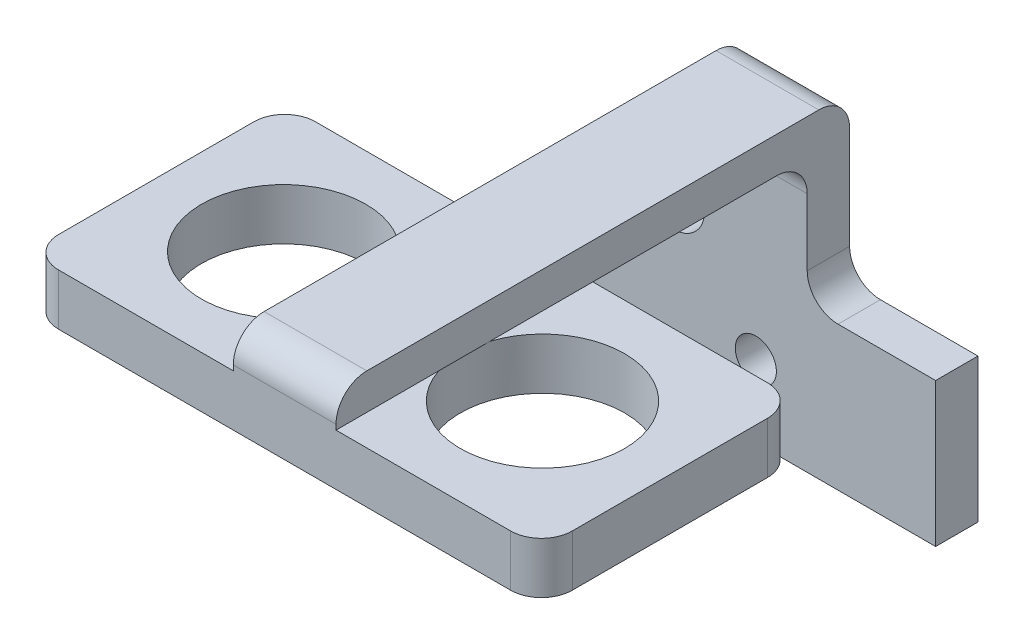
ISO-10303-21;
HEADER;
FILE_DESCRIPTION(('STEP AP214'),'2;1');
FILE_NAME('part.step','',(''),(''),'','','');
FILE_SCHEMA(('AUTOMOTIVE_DESIGN { 1 0 10303 214 1 1 1 1 }'));
ENDSEC;
DATA;
#1=APPLICATION_CONTEXT('core data for automotive mechanical design processes');
#2=APPLICATION_PROTOCOL_DEFINITION('international standard','automotive_design',2000,#1);
#3=PRODUCT_CONTEXT('',#1,'mechanical');
#4=PRODUCT('Part','Part','',(#3));
#5=PRODUCT_RELATED_PRODUCT_CATEGORY('part','',(#4));
#6=PRODUCT_DEFINITION_FORMATION('','',#4);
#7=PRODUCT_DEFINITION_CONTEXT('part definition',#1,'design');
#8=PRODUCT_DEFINITION('design','',#6,#7);
#9=PRODUCT_DEFINITION_SHAPE('','',#8);
#10=(LENGTH_UNIT() NAMED_UNIT(*) SI_UNIT(.MILLI.,.METRE.));
#11=(NAMED_UNIT(*) PLANE_ANGLE_UNIT() SI_UNIT($,.RADIAN.));
#12=(NAMED_UNIT(*) SI_UNIT($,.STERADIAN.) SOLID_ANGLE_UNIT());
#13=UNCERTAINTY_MEASURE_WITH_UNIT(LENGTH_MEASURE(1.E-05),#10,'distance_accuracy_value','');
#14=(GEOMETRIC_REPRESENTATION_CONTEXT(3) GLOBAL_UNCERTAINTY_ASSIGNED_CONTEXT((#13)) GLOBAL_UNIT_ASSIGNED_CONTEXT((#10,
#11,#12)) REPRESENTATION_CONTEXT('',''));
#15=CARTESIAN_POINT('',(0.,0.,0.));
#16=DIRECTION('',(0.,0.,1.));
#17=DIRECTION('',(1.,0.,0.));
#18=AXIS2_PLACEMENT_3D('',#15,#16,#17);
#19=CARTESIAN_POINT('',(-5.,3.5,12.5));
#20=DIRECTION('',(1.,0.,0.));
#21=DIRECTION('',(0.,0.,-1.));
#22=AXIS2_PLACEMENT_3D('',#19,#20,#21);
#23=PLANE('',#22);
#24=DIRECTION('',(0.,-1.,0.));
#25=VECTOR('',#24,1.);
#26=CARTESIAN_POINT('',(-5.,3.5,12.5));
#27=LINE('',#26,#25);
#28=CARTESIAN_POINT('',(-5.,0.5,12.5));
#29=VERTEX_POINT('',#28);
#30=CARTESIAN_POINT('',(-5.,0.,12.5));
#31=VERTEX_POINT('',#30);
#32=EDGE_CURVE('E275',#29,#31,#27,.T.);
#33=ORIENTED_EDGE('',*,*,#32,.F.);
#34=CARTESIAN_POINT('',(-5.,0.5,9.5));
#35=DIRECTION('',(1.,0.,0.));
#36=DIRECTION('',(0.,0.,-1.));
#37=AXIS2_PLACEMENT_3D('',#34,#35,#36);
#38=CIRCLE('',#37,3.);
#39=CARTESIAN_POINT('',(-5.,3.5,9.5));
#40=VERTEX_POINT('',#39);
#41=EDGE_CURVE('E367',#29,#40,#38,.F.);
#42=ORIENTED_EDGE('',*,*,#41,.T.);
#43=DIRECTION('',(0.,0.,1.));
#44=VECTOR('',#43,1.);
#45=CARTESIAN_POINT('',(-5.,3.5,12.5));
#46=LINE('',#45,#44);
#47=CARTESIAN_POINT('',(-5.,3.5,-34.5));
#48=VERTEX_POINT('',#47);
#49=EDGE_CURVE('E272',#48,#40,#46,.T.);
#50=ORIENTED_EDGE('',*,*,#49,.F.);
#51=CARTESIAN_POINT('',(-5.,0.5,-34.5));
#52=DIRECTION('',(1.,0.,0.));
#53=DIRECTION('',(0.,0.,-1.));
#54=AXIS2_PLACEMENT_3D('',#51,#52,#53);
#55=CIRCLE('',#54,3.);
#56=CARTESIAN_POINT('',(-5.,0.5,-37.5));
#57=VERTEX_POINT('',#56);
#58=EDGE_CURVE('E361',#48,#57,#55,.F.);
#59=ORIENTED_EDGE('',*,*,#58,.T.);
#60=DIRECTION('',(0.,-1.,0.));
#61=VECTOR('',#60,1.);
#62=CARTESIAN_POINT('',(-5.,3.5,-37.5));
#63=LINE('',#62,#61);
#64=CARTESIAN_POINT('',(-5.,-9.5,-37.5));
#65=VERTEX_POINT('',#64);
#66=EDGE_CURVE('E282',#57,#65,#63,.T.);
#67=ORIENTED_EDGE('',*,*,#66,.T.);
#68=DIRECTION('',(0.,0.,-1.));
#69=VECTOR('',#68,1.);
#70=CARTESIAN_POINT('',(-5.,-9.5,-33.3733612671495));
#71=LINE('',#70,#69);
#72=CARTESIAN_POINT('',(-5.,-9.5,-33.3733612671495));
#73=VERTEX_POINT('',#72);
#74=EDGE_CURVE('E364',#65,#73,#71,.F.);
#75=ORIENTED_EDGE('',*,*,#74,.T.);
#76=DIRECTION('',(0.,1.,0.));
#77=VECTOR('',#76,1.);
#78=CARTESIAN_POINT('',(-5.,-26.5,-33.3733612671495));
#79=LINE('',#78,#77);
#80=CARTESIAN_POINT('',(-5.,-3.,-33.3733612671495));
#81=VERTEX_POINT('',#80);
#82=EDGE_CURVE('E255',#73,#81,#79,.T.);
#83=ORIENTED_EDGE('',*,*,#82,.T.);
#84=CARTESIAN_POINT('',(-5.,-3.,-30.3733612671495));
#85=DIRECTION('',(1.,0.,0.));
#86=DIRECTION('',(0.,0.,-1.));
#87=AXIS2_PLACEMENT_3D('',#84,#85,#86);
#88=CIRCLE('',#87,3.);
#89=CARTESIAN_POINT('',(-5.,0.,-30.3733612671495));
#90=VERTEX_POINT('',#89);
#91=EDGE_CURVE('E434',#81,#90,#88,.T.);
#92=ORIENTED_EDGE('',*,*,#91,.T.);
#93=DIRECTION('',(0.,0.,1.));
#94=VECTOR('',#93,1.);
#95=CARTESIAN_POINT('',(-5.,0.,12.5));
#96=LINE('',#95,#94);
#97=CARTESIAN_POINT('',(-5.,0.,-12.5));
#98=VERTEX_POINT('',#97);
#99=EDGE_CURVE('E251',#90,#98,#96,.T.);
#100=ORIENTED_EDGE('',*,*,#99,.T.);
#101=CARTESIAN_POINT('',(-5.,0.,-2.4979991993593));
#102=VERTEX_POINT('',#101);
#103=EDGE_CURVE('E336',#98,#102,#96,.T.);
#104=ORIENTED_EDGE('',*,*,#103,.T.);
#105=CARTESIAN_POINT('',(-5.,0.,2.4979991993593));
#106=VERTEX_POINT('',#105);
#107=EDGE_CURVE('E574',#102,#106,#96,.T.);
#108=ORIENTED_EDGE('',*,*,#107,.T.);
#109=EDGE_CURVE('E315',#106,#31,#96,.T.);
#110=ORIENTED_EDGE('',*,*,#109,.T.);
#111=EDGE_LOOP('',(#33,#42,#50,#59,#67,#75,#83,#92,#100,#104,#108,#110));
#112=FACE_BOUND('',#111,.T.);
#113=ADVANCED_FACE('F45',(#112),#23,.F.);
#114=CARTESIAN_POINT('',(5.,3.5,-37.5));
#115=DIRECTION('',(-1.,0.,0.));
#116=DIRECTION('',(0.,0.,1.));
#117=AXIS2_PLACEMENT_3D('',#114,#115,#116);
#118=PLANE('',#117);
#119=DIRECTION('',(0.,1.,0.));
#120=VECTOR('',#119,1.);
#121=CARTESIAN_POINT('',(5.,-26.5,-33.3733612671495));
#122=LINE('',#121,#120);
#123=CARTESIAN_POINT('',(5.,-9.5,-33.3733612671495));
#124=VERTEX_POINT('',#123);
#125=CARTESIAN_POINT('',(5.,-3.,-33.3733612671495));
#126=VERTEX_POINT('',#125);
#127=EDGE_CURVE('E259',#124,#126,#122,.T.);
#128=ORIENTED_EDGE('',*,*,#127,.F.);
#129=DIRECTION('',(0.,0.,1.));
#130=VECTOR('',#129,1.);
#131=CARTESIAN_POINT('',(5.,-9.5,-37.5));
#132=LINE('',#131,#130);
#133=CARTESIAN_POINT('',(5.,-9.5,-37.5));
#134=VERTEX_POINT('',#133);
#135=EDGE_CURVE('E342',#124,#134,#132,.F.);
#136=ORIENTED_EDGE('',*,*,#135,.T.);
#137=DIRECTION('',(0.,-1.,0.));
#138=VECTOR('',#137,1.);
#139=CARTESIAN_POINT('',(5.,3.5,-37.5));
#140=LINE('',#139,#138);
#141=CARTESIAN_POINT('',(5.,0.5,-37.5));
#142=VERTEX_POINT('',#141);
#143=EDGE_CURVE('E290',#142,#134,#140,.T.);
#144=ORIENTED_EDGE('',*,*,#143,.F.);
#145=CARTESIAN_POINT('',(5.,0.5,-34.5));
#146=DIRECTION('',(-1.,0.,0.));
#147=DIRECTION('',(0.,0.,1.));
#148=AXIS2_PLACEMENT_3D('',#145,#146,#147);
#149=CIRCLE('',#148,3.);
#150=CARTESIAN_POINT('',(5.,3.5,-34.5));
#151=VERTEX_POINT('',#150);
#152=EDGE_CURVE('E335',#142,#151,#149,.F.);
#153=ORIENTED_EDGE('',*,*,#152,.T.);
#154=DIRECTION('',(0.,0.,-1.));
#155=VECTOR('',#154,1.);
#156=CARTESIAN_POINT('',(5.,3.5,-37.5));
#157=LINE('',#156,#155);
#158=CARTESIAN_POINT('',(5.,3.5,9.5));
#159=VERTEX_POINT('',#158);
#160=EDGE_CURVE('E269',#159,#151,#157,.T.);
#161=ORIENTED_EDGE('',*,*,#160,.F.);
#162=CARTESIAN_POINT('',(5.,0.5,9.5));
#163=DIRECTION('',(-1.,0.,0.));
#164=DIRECTION('',(0.,0.,1.));
#165=AXIS2_PLACEMENT_3D('',#162,#163,#164);
#166=CIRCLE('',#165,3.);
#167=CARTESIAN_POINT('',(5.,0.5,12.5));
#168=VERTEX_POINT('',#167);
#169=EDGE_CURVE('E339',#159,#168,#166,.F.);
#170=ORIENTED_EDGE('',*,*,#169,.T.);
#171=DIRECTION('',(0.,-1.,0.));
#172=VECTOR('',#171,1.);
#173=CARTESIAN_POINT('',(5.,3.5,12.5));
#174=LINE('',#173,#172);
#175=CARTESIAN_POINT('',(5.,0.,12.5));
#176=VERTEX_POINT('',#175);
#177=EDGE_CURVE('E296',#168,#176,#174,.T.);
#178=ORIENTED_EDGE('',*,*,#177,.T.);
#179=DIRECTION('',(0.,0.,-1.));
#180=VECTOR('',#179,1.);
#181=CARTESIAN_POINT('',(5.,0.,-37.5));
#182=LINE('',#181,#180);
#183=CARTESIAN_POINT('',(5.,0.,2.4979991993593));
#184=VERTEX_POINT('',#183);
#185=EDGE_CURVE('E245',#176,#184,#182,.T.);
#186=ORIENTED_EDGE('',*,*,#185,.T.);
#187=CARTESIAN_POINT('',(5.,0.,-2.4979991993593));
#188=VERTEX_POINT('',#187);
#189=EDGE_CURVE('E230',#184,#188,#182,.T.);
#190=ORIENTED_EDGE('',*,*,#189,.T.);
#191=CARTESIAN_POINT('',(5.,0.,-12.5));
#192=VERTEX_POINT('',#191);
#193=EDGE_CURVE('E234',#188,#192,#182,.T.);
#194=ORIENTED_EDGE('',*,*,#193,.T.);
#195=CARTESIAN_POINT('',(5.,0.,-30.3733612671495));
#196=VERTEX_POINT('',#195);
#197=EDGE_CURVE('E243',#192,#196,#182,.T.);
#198=ORIENTED_EDGE('',*,*,#197,.T.);
#199=CARTESIAN_POINT('',(5.,-3.,-30.3733612671495));
#200=DIRECTION('',(-1.,0.,0.));
#201=DIRECTION('',(0.,0.,1.));
#202=AXIS2_PLACEMENT_3D('',#199,#200,#201);
#203=CIRCLE('',#202,3.);
#204=EDGE_CURVE('E437',#196,#126,#203,.T.);
#205=ORIENTED_EDGE('',*,*,#204,.T.);
#206=EDGE_LOOP('',(#128,#136,#144,#153,#161,#170,#178,#186,#190,#194,#198,#205));
#207=FACE_BOUND('',#206,.T.);
#208=ADVANCED_FACE('F247',(#207),#118,.F.);
#209=CARTESIAN_POINT('',(0.,0.,0.));
#210=DIRECTION('',(0.,-1.,0.));
#211=DIRECTION('',(0.,0.,-1.));
#212=AXIS2_PLACEMENT_3D('',#209,#210,#211);
#213=PLANE('',#212);
#214=ORIENTED_EDGE('',*,*,#99,.F.);
#215=DIRECTION('',(-1.,0.,0.));
#216=VECTOR('',#215,1.);
#217=CARTESIAN_POINT('',(0.,0.,-30.3733612671495));
#218=LINE('',#217,#216);
#219=EDGE_CURVE('E374',#90,#196,#218,.F.);
#220=ORIENTED_EDGE('',*,*,#219,.T.);
#221=ORIENTED_EDGE('',*,*,#197,.F.);
#222=DIRECTION('',(1.,0.,0.));
#223=VECTOR('',#222,1.);
#224=CARTESIAN_POINT('',(-25.,0.,-12.5));
#225=LINE('',#224,#223);
#226=EDGE_CURVE('E312',#98,#192,#225,.T.);
#227=ORIENTED_EDGE('',*,*,#226,.F.);
#228=EDGE_LOOP('',(#214,#220,#221,#227));
#229=FACE_BOUND('',#228,.T.);
#230=ADVANCED_FACE('F587',(#229),#213,.T.);
#231=CARTESIAN_POINT('',(0.,0.,0.));
#232=DIRECTION('',(0.,-1.,0.));
#233=DIRECTION('',(0.,0.,-1.));
#234=AXIS2_PLACEMENT_3D('',#231,#232,#233);
#235=PLANE('',#234);
#236=CARTESIAN_POINT('',(-22.,0.,-12.5));
#237=VERTEX_POINT('',#236);
#238=EDGE_CURVE('E308',#237,#98,#225,.T.);
#239=ORIENTED_EDGE('',*,*,#238,.F.);
#240=CARTESIAN_POINT('',(-22.,0.,-9.5));
#241=DIRECTION('',(0.,-1.,0.));
#242=DIRECTION('',(0.,0.,-1.));
#243=AXIS2_PLACEMENT_3D('',#240,#241,#242);
#244=CIRCLE('',#243,3.);
#245=CARTESIAN_POINT('',(-25.,0.,-9.5));
#246=VERTEX_POINT('',#245);
#247=EDGE_CURVE('E406',#237,#246,#244,.F.);
#248=ORIENTED_EDGE('',*,*,#247,.T.);
#249=DIRECTION('',(0.,0.,-1.));
#250=VECTOR('',#249,1.);
#251=CARTESIAN_POINT('',(-25.,0.,12.5));
#252=LINE('',#251,#250);
#253=CARTESIAN_POINT('',(-25.,0.,9.5));
#254=VERTEX_POINT('',#253);
#255=EDGE_CURVE('E303',#254,#246,#252,.T.);
#256=ORIENTED_EDGE('',*,*,#255,.F.);
#257=CARTESIAN_POINT('',(-22.,0.,9.5));
#258=DIRECTION('',(0.,-1.,0.));
#259=DIRECTION('',(0.,0.,-1.));
#260=AXIS2_PLACEMENT_3D('',#257,#258,#259);
#261=CIRCLE('',#260,3.);
#262=CARTESIAN_POINT('',(-22.,0.,12.5));
#263=VERTEX_POINT('',#262);
#264=EDGE_CURVE('E403',#254,#263,#261,.F.);
#265=ORIENTED_EDGE('',*,*,#264,.T.);
#266=DIRECTION('',(-1.,0.,0.));
#267=VECTOR('',#266,1.);
#268=CARTESIAN_POINT('',(25.,0.,12.5));
#269=LINE('',#268,#267);
#270=EDGE_CURVE('E304',#31,#263,#269,.T.);
#271=ORIENTED_EDGE('',*,*,#270,.F.);
#272=ORIENTED_EDGE('',*,*,#109,.F.);
#273=CARTESIAN_POINT('',(-12.6,0.,0.));
#274=DIRECTION('',(0.,-1.,0.));
#275=DIRECTION('',(0.,0.,-1.));
#276=AXIS2_PLACEMENT_3D('',#273,#274,#275);
#277=CIRCLE('',#276,7.99999999999998);
#278=EDGE_CURVE('E536',#106,#102,#277,.T.);
#279=ORIENTED_EDGE('',*,*,#278,.T.);
#280=ORIENTED_EDGE('',*,*,#103,.F.);
#281=EDGE_LOOP('',(#239,#248,#256,#265,#271,#272,#279,#280));
#282=FACE_BOUND('',#281,.T.);
#283=ADVANCED_FACE('F564',(#282),#235,.F.);
#284=ORIENTED_EDGE('',*,*,#193,.F.);
#285=CARTESIAN_POINT('',(12.6,0.,0.));
#286=DIRECTION('',(0.,-1.,0.));
#287=DIRECTION('',(0.,0.,-1.));
#288=AXIS2_PLACEMENT_3D('',#285,#286,#287);
#289=CIRCLE('',#288,7.99999999999998);
#290=EDGE_CURVE('E218',#188,#184,#289,.T.);
#291=ORIENTED_EDGE('',*,*,#290,.T.);
#292=ORIENTED_EDGE('',*,*,#185,.F.);
#293=CARTESIAN_POINT('',(22.,0.,12.5));
#294=VERTEX_POINT('',#293);
#295=EDGE_CURVE('E300',#294,#176,#269,.T.);
#296=ORIENTED_EDGE('',*,*,#295,.F.);
#297=CARTESIAN_POINT('',(22.,0.,9.5));
#298=DIRECTION('',(0.,-1.,0.));
#299=DIRECTION('',(0.,0.,-1.));
#300=AXIS2_PLACEMENT_3D('',#297,#298,#299);
#301=CIRCLE('',#300,3.);
#302=CARTESIAN_POINT('',(25.,0.,9.5));
#303=VERTEX_POINT('',#302);
#304=EDGE_CURVE('E68',#294,#303,#301,.F.);
#305=ORIENTED_EDGE('',*,*,#304,.T.);
#306=DIRECTION('',(0.,0.,1.));
#307=VECTOR('',#306,1.);
#308=CARTESIAN_POINT('',(25.,0.,-12.5));
#309=LINE('',#308,#307);
#310=CARTESIAN_POINT('',(25.,0.,-9.5));
#311=VERTEX_POINT('',#310);
#312=EDGE_CURVE('E311',#311,#303,#309,.T.);
#313=ORIENTED_EDGE('',*,*,#312,.F.);
#314=CARTESIAN_POINT('',(22.,0.,-9.5));
#315=DIRECTION('',(0.,-1.,0.));
#316=DIRECTION('',(0.,0.,-1.));
#317=AXIS2_PLACEMENT_3D('',#314,#315,#316);
#318=CIRCLE('',#317,3.);
#319=CARTESIAN_POINT('',(22.,0.,-12.5));
#320=VERTEX_POINT('',#319);
#321=EDGE_CURVE('E423',#311,#320,#318,.F.);
#322=ORIENTED_EDGE('',*,*,#321,.T.);
#323=EDGE_CURVE('E237',#192,#320,#225,.T.);
#324=ORIENTED_EDGE('',*,*,#323,.F.);
#325=EDGE_LOOP('',(#284,#291,#292,#296,#305,#313,#322,#324));
#326=FACE_BOUND('',#325,.T.);
#327=ADVANCED_FACE('F235',(#326),#235,.F.);
#328=CARTESIAN_POINT('',(25.,0.,12.5));
#329=DIRECTION('',(0.,0.,1.));
#330=DIRECTION('',(1.,0.,0.));
#331=AXIS2_PLACEMENT_3D('',#328,#329,#330);
#332=PLANE('',#331);
#333=ORIENTED_EDGE('',*,*,#177,.F.);
#334=DIRECTION('',(1.,0.,0.));
#335=VECTOR('',#334,1.);
#336=CARTESIAN_POINT('',(-5.,0.5,12.5));
#337=LINE('',#336,#335);
#338=EDGE_CURVE('E358',#168,#29,#337,.F.);
#339=ORIENTED_EDGE('',*,*,#338,.T.);
#340=ORIENTED_EDGE('',*,*,#32,.T.);
#341=ORIENTED_EDGE('',*,*,#270,.T.);
#342=DIRECTION('',(0.,-1.,0.));
#343=VECTOR('',#342,1.);
#344=CARTESIAN_POINT('',(-22.,0.,12.5));
#345=LINE('',#344,#343);
#346=CARTESIAN_POINT('',(-22.,-5.,12.5));
#347=VERTEX_POINT('',#346);
#348=EDGE_CURVE('E354',#263,#347,#345,.T.);
#349=ORIENTED_EDGE('',*,*,#348,.T.);
#350=DIRECTION('',(-1.,0.,0.));
#351=VECTOR('',#350,1.);
#352=CARTESIAN_POINT('',(25.,-5.,12.5));
#353=LINE('',#352,#351);
#354=CARTESIAN_POINT('',(22.,-5.,12.5));
#355=VERTEX_POINT('',#354);
#356=EDGE_CURVE('E299',#355,#347,#353,.T.);
#357=ORIENTED_EDGE('',*,*,#356,.F.);
#358=DIRECTION('',(0.,-1.,0.));
#359=VECTOR('',#358,1.);
#360=CARTESIAN_POINT('',(22.,0.,12.5));
#361=LINE('',#360,#359);
#362=EDGE_CURVE('E351',#355,#294,#361,.F.);
#363=ORIENTED_EDGE('',*,*,#362,.T.);
#364=ORIENTED_EDGE('',*,*,#295,.T.);
#365=EDGE_LOOP('',(#333,#339,#340,#341,#349,#357,#363,#364));
#366=FACE_BOUND('',#365,.T.);
#367=ADVANCED_FACE('F567',(#366),#332,.T.);
#368=CARTESIAN_POINT('',(25.,0.,-12.5));
#369=DIRECTION('',(1.,0.,0.));
#370=DIRECTION('',(0.,0.,-1.));
#371=AXIS2_PLACEMENT_3D('',#368,#369,#370);
#372=PLANE('',#371);
#373=ORIENTED_EDGE('',*,*,#312,.T.);
#374=DIRECTION('',(0.,-1.,0.));
#375=VECTOR('',#374,1.);
#376=CARTESIAN_POINT('',(25.,0.,9.5));
#377=LINE('',#376,#375);
#378=CARTESIAN_POINT('',(25.,-5.,9.5));
#379=VERTEX_POINT('',#378);
#380=EDGE_CURVE('E419',#303,#379,#377,.T.);
#381=ORIENTED_EDGE('',*,*,#380,.T.);
#382=DIRECTION('',(0.,0.,1.));
#383=VECTOR('',#382,1.);
#384=CARTESIAN_POINT('',(25.,-5.,-12.5));
#385=LINE('',#384,#383);
#386=CARTESIAN_POINT('',(25.,-5.,-9.5));
#387=VERTEX_POINT('',#386);
#388=EDGE_CURVE('E327',#387,#379,#385,.T.);
#389=ORIENTED_EDGE('',*,*,#388,.F.);
#390=DIRECTION('',(0.,-1.,0.));
#391=VECTOR('',#390,1.);
#392=CARTESIAN_POINT('',(25.,0.,-9.5));
#393=LINE('',#392,#391);
#394=EDGE_CURVE('E416',#387,#311,#393,.F.);
#395=ORIENTED_EDGE('',*,*,#394,.T.);
#396=EDGE_LOOP('',(#373,#381,#389,#395));
#397=FACE_BOUND('',#396,.T.);
#398=ADVANCED_FACE('F622',(#397),#372,.T.);
#399=CARTESIAN_POINT('',(-25.,0.,-12.5));
#400=DIRECTION('',(0.,0.,-1.));
#401=DIRECTION('',(-1.,0.,0.));
#402=AXIS2_PLACEMENT_3D('',#399,#400,#401);
#403=PLANE('',#402);
#404=DIRECTION('',(1.,0.,0.));
#405=VECTOR('',#404,1.);
#406=CARTESIAN_POINT('',(-25.,-5.,-12.5));
#407=LINE('',#406,#405);
#408=CARTESIAN_POINT('',(-22.,-5.,-12.5));
#409=VERTEX_POINT('',#408);
#410=CARTESIAN_POINT('',(22.,-5.,-12.5));
#411=VERTEX_POINT('',#410);
#412=EDGE_CURVE('E323',#409,#411,#407,.T.);
#413=ORIENTED_EDGE('',*,*,#412,.F.);
#414=DIRECTION('',(0.,-1.,0.));
#415=VECTOR('',#414,1.);
#416=CARTESIAN_POINT('',(-22.,0.,-12.5));
#417=LINE('',#416,#415);
#418=EDGE_CURVE('E400',#409,#237,#417,.F.);
#419=ORIENTED_EDGE('',*,*,#418,.T.);
#420=ORIENTED_EDGE('',*,*,#238,.T.);
#421=ORIENTED_EDGE('',*,*,#226,.T.);
#422=ORIENTED_EDGE('',*,*,#323,.T.);
#423=DIRECTION('',(0.,-1.,0.));
#424=VECTOR('',#423,1.);
#425=CARTESIAN_POINT('',(22.,0.,-12.5));
#426=LINE('',#425,#424);
#427=EDGE_CURVE('E396',#320,#411,#426,.T.);
#428=ORIENTED_EDGE('',*,*,#427,.T.);
#429=EDGE_LOOP('',(#413,#419,#420,#421,#422,#428));
#430=FACE_BOUND('',#429,.T.);
#431=ADVANCED_FACE('F589',(#430),#403,.T.);
#432=CARTESIAN_POINT('',(-25.,0.,12.5));
#433=DIRECTION('',(-1.,0.,0.));
#434=DIRECTION('',(0.,0.,1.));
#435=AXIS2_PLACEMENT_3D('',#432,#433,#434);
#436=PLANE('',#435);
#437=ORIENTED_EDGE('',*,*,#255,.T.);
#438=DIRECTION('',(0.,-1.,0.));
#439=VECTOR('',#438,1.);
#440=CARTESIAN_POINT('',(-25.,0.,-9.5));
#441=LINE('',#440,#439);
#442=CARTESIAN_POINT('',(-25.,-5.,-9.5));
#443=VERTEX_POINT('',#442);
#444=EDGE_CURVE('E380',#246,#443,#441,.T.);
#445=ORIENTED_EDGE('',*,*,#444,.T.);
#446=DIRECTION('',(0.,0.,-1.));
#447=VECTOR('',#446,1.);
#448=CARTESIAN_POINT('',(-25.,-5.,12.5));
#449=LINE('',#448,#447);
#450=CARTESIAN_POINT('',(-25.,-5.,9.5));
#451=VERTEX_POINT('',#450);
#452=EDGE_CURVE('E319',#451,#443,#449,.T.);
#453=ORIENTED_EDGE('',*,*,#452,.F.);
#454=DIRECTION('',(0.,-1.,0.));
#455=VECTOR('',#454,1.);
#456=CARTESIAN_POINT('',(-25.,0.,9.5));
#457=LINE('',#456,#455);
#458=EDGE_CURVE('E377',#451,#254,#457,.F.);
#459=ORIENTED_EDGE('',*,*,#458,.T.);
#460=EDGE_LOOP('',(#437,#445,#453,#459));
#461=FACE_BOUND('',#460,.T.);
#462=ADVANCED_FACE('F547',(#461),#436,.T.);
#463=CARTESIAN_POINT('',(0.,-5.,0.));
#464=DIRECTION('',(0.,-1.,0.));
#465=DIRECTION('',(0.,0.,-1.));
#466=AXIS2_PLACEMENT_3D('',#463,#464,#465);
#467=PLANE('',#466);
#468=CARTESIAN_POINT('',(12.6,-5.,0.));
#469=DIRECTION('',(0.,-1.,0.));
#470=DIRECTION('',(0.,0.,-1.));
#471=AXIS2_PLACEMENT_3D('',#468,#469,#470);
#472=CIRCLE('',#471,7.99999999999998);
#473=CARTESIAN_POINT('',(12.6,-5.,-7.99999999999998));
#474=VERTEX_POINT('',#473);
#475=EDGE_CURVE('E225',#474,#474,#472,.T.);
#476=ORIENTED_EDGE('',*,*,#475,.F.);
#477=EDGE_LOOP('',(#476));
#478=FACE_BOUND('',#477,.T.);
#479=CARTESIAN_POINT('',(-12.6,-5.,0.));
#480=DIRECTION('',(0.,-1.,0.));
#481=DIRECTION('',(0.,0.,-1.));
#482=AXIS2_PLACEMENT_3D('',#479,#480,#481);
#483=CIRCLE('',#482,7.99999999999998);
#484=CARTESIAN_POINT('',(-12.6,-5.,-7.99999999999998));
#485=VERTEX_POINT('',#484);
#486=EDGE_CURVE('E232',#485,#485,#483,.T.);
#487=ORIENTED_EDGE('',*,*,#486,.F.);
#488=EDGE_LOOP('',(#487));
#489=FACE_BOUND('',#488,.T.);
#490=ORIENTED_EDGE('',*,*,#452,.T.);
#491=CARTESIAN_POINT('',(-22.,-5.,-9.5));
#492=DIRECTION('',(0.,-1.,0.));
#493=DIRECTION('',(0.,0.,-1.));
#494=AXIS2_PLACEMENT_3D('',#491,#492,#493);
#495=CIRCLE('',#494,3.);
#496=EDGE_CURVE('E393',#443,#409,#495,.T.);
#497=ORIENTED_EDGE('',*,*,#496,.T.);
#498=ORIENTED_EDGE('',*,*,#412,.T.);
#499=CARTESIAN_POINT('',(22.,-5.,-9.5));
#500=DIRECTION('',(0.,-1.,0.));
#501=DIRECTION('',(0.,0.,-1.));
#502=AXIS2_PLACEMENT_3D('',#499,#500,#501);
#503=CIRCLE('',#502,3.);
#504=EDGE_CURVE('E384',#411,#387,#503,.T.);
#505=ORIENTED_EDGE('',*,*,#504,.T.);
#506=ORIENTED_EDGE('',*,*,#388,.T.);
#507=CARTESIAN_POINT('',(22.,-5.,9.5));
#508=DIRECTION('',(0.,-1.,0.));
#509=DIRECTION('',(0.,0.,-1.));
#510=AXIS2_PLACEMENT_3D('',#507,#508,#509);
#511=CIRCLE('',#510,3.);
#512=EDGE_CURVE('E387',#379,#355,#511,.T.);
#513=ORIENTED_EDGE('',*,*,#512,.T.);
#514=ORIENTED_EDGE('',*,*,#356,.T.);
#515=CARTESIAN_POINT('',(-22.,-5.,9.5));
#516=DIRECTION('',(0.,-1.,0.));
#517=DIRECTION('',(0.,0.,-1.));
#518=AXIS2_PLACEMENT_3D('',#515,#516,#517);
#519=CIRCLE('',#518,3.);
#520=EDGE_CURVE('E390',#347,#451,#519,.T.);
#521=ORIENTED_EDGE('',*,*,#520,.T.);
#522=EDGE_LOOP('',(#490,#497,#498,#505,#506,#513,#514,#521));
#523=FACE_BOUND('',#522,.T.);
#524=ADVANCED_FACE('F544',(#478,#489,#523),#467,.T.);
#525=CARTESIAN_POINT('',(-5.,3.5,-37.5));
#526=DIRECTION('',(0.,0.,1.));
#527=DIRECTION('',(1.,0.,0.));
#528=AXIS2_PLACEMENT_3D('',#525,#526,#527);
#529=PLANE('',#528);
#530=CARTESIAN_POINT('',(0.,-19.5,-37.5));
#531=DIRECTION('',(0.,0.,-1.));
#532=DIRECTION('',(-1.,0.,0.));
#533=AXIS2_PLACEMENT_3D('',#530,#531,#532);
#534=CIRCLE('',#533,1.99999999999999);
#535=CARTESIAN_POINT('',(-1.99999999999999,-19.5,-37.5));
#536=VERTEX_POINT('',#535);
#537=EDGE_CURVE('E528',#536,#536,#534,.T.);
#538=ORIENTED_EDGE('',*,*,#537,.F.);
#539=EDGE_LOOP('',(#538));
#540=FACE_BOUND('',#539,.T.);
#541=ORIENTED_EDGE('',*,*,#66,.F.);
#542=DIRECTION('',(-1.,0.,0.));
#543=VECTOR('',#542,1.);
#544=CARTESIAN_POINT('',(-5.,0.5,-37.5));
#545=LINE('',#544,#543);
#546=EDGE_CURVE('E413',#57,#142,#545,.F.);
#547=ORIENTED_EDGE('',*,*,#546,.T.);
#548=ORIENTED_EDGE('',*,*,#143,.T.);
#549=CARTESIAN_POINT('',(8.,-9.5,-37.5));
#550=DIRECTION('',(0.,0.,1.));
#551=DIRECTION('',(1.,0.,0.));
#552=AXIS2_PLACEMENT_3D('',#549,#550,#551);
#553=CIRCLE('',#552,3.);
#554=CARTESIAN_POINT('',(8.,-12.5,-37.5));
#555=VERTEX_POINT('',#554);
#556=EDGE_CURVE('E431',#134,#555,#553,.T.);
#557=ORIENTED_EDGE('',*,*,#556,.T.);
#558=DIRECTION('',(-1.,0.,0.));
#559=VECTOR('',#558,1.);
#560=CARTESIAN_POINT('',(17.5,-12.5,-37.5));
#561=LINE('',#560,#559);
#562=CARTESIAN_POINT('',(17.5,-12.5,-37.5));
#563=VERTEX_POINT('',#562);
#564=EDGE_CURVE('E484',#563,#555,#561,.T.);
#565=ORIENTED_EDGE('',*,*,#564,.F.);
#566=DIRECTION('',(0.,1.,0.));
#567=VECTOR('',#566,1.);
#568=CARTESIAN_POINT('',(17.5,-12.5,-37.5));
#569=LINE('',#568,#567);
#570=CARTESIAN_POINT('',(17.5,-26.5,-37.5));
#571=VERTEX_POINT('',#570);
#572=EDGE_CURVE('E481',#571,#563,#569,.T.);
#573=ORIENTED_EDGE('',*,*,#572,.F.);
#574=DIRECTION('',(1.,0.,0.));
#575=VECTOR('',#574,1.);
#576=CARTESIAN_POINT('',(5.,-26.5,-37.5));
#577=LINE('',#576,#575);
#578=CARTESIAN_POINT('',(-17.5,-26.5,-37.5));
#579=VERTEX_POINT('',#578);
#580=EDGE_CURVE('E265',#579,#571,#577,.T.);
#581=ORIENTED_EDGE('',*,*,#580,.F.);
#582=DIRECTION('',(0.,-1.,0.));
#583=VECTOR('',#582,1.);
#584=CARTESIAN_POINT('',(-17.5,-26.5,-37.5));
#585=LINE('',#584,#583);
#586=CARTESIAN_POINT('',(-17.5,-12.5,-37.5));
#587=VERTEX_POINT('',#586);
#588=EDGE_CURVE('E515',#587,#579,#585,.T.);
#589=ORIENTED_EDGE('',*,*,#588,.F.);
#590=DIRECTION('',(1.,0.,0.));
#591=VECTOR('',#590,1.);
#592=CARTESIAN_POINT('',(-17.5,-12.5,-37.5));
#593=LINE('',#592,#591);
#594=CARTESIAN_POINT('',(-8.,-12.5,-37.5));
#595=VERTEX_POINT('',#594);
#596=EDGE_CURVE('E447',#587,#595,#593,.T.);
#597=ORIENTED_EDGE('',*,*,#596,.T.);
#598=CARTESIAN_POINT('',(-8.,-9.5,-37.5));
#599=DIRECTION('',(0.,0.,1.));
#600=DIRECTION('',(1.,0.,0.));
#601=AXIS2_PLACEMENT_3D('',#598,#599,#600);
#602=CIRCLE('',#601,3.);
#603=EDGE_CURVE('E54',#595,#65,#602,.T.);
#604=ORIENTED_EDGE('',*,*,#603,.T.);
#605=EDGE_LOOP('',(#541,#547,#548,#557,#565,#573,#581,#589,#597,#604));
#606=FACE_BOUND('',#605,.T.);
#607=ADVANCED_FACE('F443',(#540,#606),#529,.F.);
#608=CARTESIAN_POINT('',(0.,3.5,0.));
#609=DIRECTION('',(0.,-1.,0.));
#610=DIRECTION('',(0.,0.,-1.));
#611=AXIS2_PLACEMENT_3D('',#608,#609,#610);
#612=PLANE('',#611);
#613=ORIENTED_EDGE('',*,*,#49,.T.);
#614=DIRECTION('',(1.,0.,0.));
#615=VECTOR('',#614,1.);
#616=CARTESIAN_POINT('',(5.,3.5,9.5));
#617=LINE('',#616,#615);
#618=EDGE_CURVE('E348',#40,#159,#617,.T.);
#619=ORIENTED_EDGE('',*,*,#618,.T.);
#620=ORIENTED_EDGE('',*,*,#160,.T.);
#621=DIRECTION('',(-1.,0.,0.));
#622=VECTOR('',#621,1.);
#623=CARTESIAN_POINT('',(0.,3.5,-34.5));
#624=LINE('',#623,#622);
#625=EDGE_CURVE('E345',#151,#48,#624,.T.);
#626=ORIENTED_EDGE('',*,*,#625,.T.);
#627=EDGE_LOOP('',(#613,#619,#620,#626));
#628=FACE_BOUND('',#627,.T.);
#629=ADVANCED_FACE('F617',(#628),#612,.F.);
#630=CARTESIAN_POINT('',(-5.,-26.5,-33.3733612671495));
#631=DIRECTION('',(0.,0.,-1.));
#632=DIRECTION('',(-1.,0.,0.));
#633=AXIS2_PLACEMENT_3D('',#630,#631,#632);
#634=PLANE('',#633);
#635=CARTESIAN_POINT('',(0.,-19.5,-33.3733612671495));
#636=DIRECTION('',(0.,0.,-1.));
#637=DIRECTION('',(-1.,0.,0.));
#638=AXIS2_PLACEMENT_3D('',#635,#636,#637);
#639=CIRCLE('',#638,1.99999999999998);
#640=CARTESIAN_POINT('',(-1.99999999999998,-19.5,-33.3733612671495));
#641=VERTEX_POINT('',#640);
#642=EDGE_CURVE('E521',#641,#641,#639,.T.);
#643=ORIENTED_EDGE('',*,*,#642,.T.);
#644=EDGE_LOOP('',(#643));
#645=FACE_BOUND('',#644,.T.);
#646=ORIENTED_EDGE('',*,*,#127,.T.);
#647=DIRECTION('',(-1.,0.,0.));
#648=VECTOR('',#647,1.);
#649=CARTESIAN_POINT('',(-5.,-3.,-33.3733612671495));
#650=LINE('',#649,#648);
#651=EDGE_CURVE('E370',#126,#81,#650,.T.);
#652=ORIENTED_EDGE('',*,*,#651,.T.);
#653=ORIENTED_EDGE('',*,*,#82,.F.);
#654=CARTESIAN_POINT('',(-8.,-9.5,-33.3733612671495));
#655=DIRECTION('',(0.,0.,-1.));
#656=DIRECTION('',(-1.,0.,0.));
#657=AXIS2_PLACEMENT_3D('',#654,#655,#656);
#658=CIRCLE('',#657,3.);
#659=CARTESIAN_POINT('',(-8.,-12.5,-33.3733612671495));
#660=VERTEX_POINT('',#659);
#661=EDGE_CURVE('E11',#73,#660,#658,.T.);
#662=ORIENTED_EDGE('',*,*,#661,.T.);
#663=DIRECTION('',(1.,0.,0.));
#664=VECTOR('',#663,1.);
#665=CARTESIAN_POINT('',(-17.5,-12.5,-33.3733612671495));
#666=LINE('',#665,#664);
#667=CARTESIAN_POINT('',(-17.5,-12.5,-33.3733612671495));
#668=VERTEX_POINT('',#667);
#669=EDGE_CURVE('E458',#668,#660,#666,.T.);
#670=ORIENTED_EDGE('',*,*,#669,.F.);
#671=DIRECTION('',(0.,1.,0.));
#672=VECTOR('',#671,1.);
#673=CARTESIAN_POINT('',(-17.5,-12.5,-33.3733612671495));
#674=LINE('',#673,#672);
#675=CARTESIAN_POINT('',(-17.5,-26.5,-33.3733612671495));
#676=VERTEX_POINT('',#675);
#677=EDGE_CURVE('E512',#676,#668,#674,.T.);
#678=ORIENTED_EDGE('',*,*,#677,.F.);
#679=DIRECTION('',(-1.,0.,0.));
#680=VECTOR('',#679,1.);
#681=CARTESIAN_POINT('',(-5.,-26.5,-33.3733612671495));
#682=LINE('',#681,#680);
#683=CARTESIAN_POINT('',(17.5,-26.5,-33.3733612671495));
#684=VERTEX_POINT('',#683);
#685=EDGE_CURVE('E492',#684,#676,#682,.T.);
#686=ORIENTED_EDGE('',*,*,#685,.F.);
#687=DIRECTION('',(0.,-1.,0.));
#688=VECTOR('',#687,1.);
#689=CARTESIAN_POINT('',(17.5,-26.5,-33.3733612671495));
#690=LINE('',#689,#688);
#691=CARTESIAN_POINT('',(17.5,-12.5,-33.3733612671495));
#692=VERTEX_POINT('',#691);
#693=EDGE_CURVE('E469',#692,#684,#690,.T.);
#694=ORIENTED_EDGE('',*,*,#693,.F.);
#695=DIRECTION('',(-1.,0.,0.));
#696=VECTOR('',#695,1.);
#697=CARTESIAN_POINT('',(17.5,-12.5,-33.3733612671495));
#698=LINE('',#697,#696);
#699=CARTESIAN_POINT('',(8.,-12.5,-33.3733612671495));
#700=VERTEX_POINT('',#699);
#701=EDGE_CURVE('E488',#692,#700,#698,.T.);
#702=ORIENTED_EDGE('',*,*,#701,.T.);
#703=CARTESIAN_POINT('',(8.,-9.5,-33.3733612671495));
#704=DIRECTION('',(0.,0.,-1.));
#705=DIRECTION('',(-1.,0.,0.));
#706=AXIS2_PLACEMENT_3D('',#703,#704,#705);
#707=CIRCLE('',#706,3.);
#708=EDGE_CURVE('E428',#700,#124,#707,.T.);
#709=ORIENTED_EDGE('',*,*,#708,.T.);
#710=EDGE_LOOP('',(#646,#652,#653,#662,#670,#678,#686,#694,#702,#709));
#711=FACE_BOUND('',#710,.T.);
#712=ADVANCED_FACE('F456',(#645,#711),#634,.F.);
#713=CARTESIAN_POINT('',(0.,-26.5,0.));
#714=DIRECTION('',(0.,1.,0.));
#715=DIRECTION('',(0.,0.,1.));
#716=AXIS2_PLACEMENT_3D('',#713,#714,#715);
#717=PLANE('',#716);
#718=ORIENTED_EDGE('',*,*,#685,.T.);
#719=DIRECTION('',(0.,0.,1.));
#720=VECTOR('',#719,1.);
#721=CARTESIAN_POINT('',(-17.5,-26.5,-33.3733612671495));
#722=LINE('',#721,#720);
#723=EDGE_CURVE('E500',#579,#676,#722,.T.);
#724=ORIENTED_EDGE('',*,*,#723,.F.);
#725=ORIENTED_EDGE('',*,*,#580,.T.);
#726=DIRECTION('',(0.,0.,-1.));
#727=VECTOR('',#726,1.);
#728=CARTESIAN_POINT('',(17.5,-26.5,-37.5));
#729=LINE('',#728,#727);
#730=EDGE_CURVE('E477',#684,#571,#729,.T.);
#731=ORIENTED_EDGE('',*,*,#730,.F.);
#732=EDGE_LOOP('',(#718,#724,#725,#731));
#733=FACE_BOUND('',#732,.T.);
#734=ADVANCED_FACE('F498',(#733),#717,.F.);
#735=CARTESIAN_POINT('',(17.5,-12.5,-33.3733612671495));
#736=DIRECTION('',(0.,-1.,0.));
#737=DIRECTION('',(0.,0.,-1.));
#738=AXIS2_PLACEMENT_3D('',#735,#736,#737);
#739=PLANE('',#738);
#740=ORIENTED_EDGE('',*,*,#564,.T.);
#741=DIRECTION('',(0.,0.,1.));
#742=VECTOR('',#741,1.);
#743=CARTESIAN_POINT('',(8.,-12.5,-33.3733612671495));
#744=LINE('',#743,#742);
#745=EDGE_CURVE('E331',#555,#700,#744,.T.);
#746=ORIENTED_EDGE('',*,*,#745,.T.);
#747=ORIENTED_EDGE('',*,*,#701,.F.);
#748=DIRECTION('',(0.,0.,1.));
#749=VECTOR('',#748,1.);
#750=CARTESIAN_POINT('',(17.5,-12.5,-33.3733612671495));
#751=LINE('',#750,#749);
#752=EDGE_CURVE('E464',#563,#692,#751,.T.);
#753=ORIENTED_EDGE('',*,*,#752,.F.);
#754=EDGE_LOOP('',(#740,#746,#747,#753));
#755=FACE_BOUND('',#754,.T.);
#756=ADVANCED_FACE('F511',(#755),#739,.F.);
#757=CARTESIAN_POINT('',(17.5,0.,0.));
#758=DIRECTION('',(-1.,0.,0.));
#759=DIRECTION('',(0.,0.,1.));
#760=AXIS2_PLACEMENT_3D('',#757,#758,#759);
#761=PLANE('',#760);
#762=ORIENTED_EDGE('',*,*,#752,.T.);
#763=ORIENTED_EDGE('',*,*,#693,.T.);
#764=ORIENTED_EDGE('',*,*,#730,.T.);
#765=ORIENTED_EDGE('',*,*,#572,.T.);
#766=EDGE_LOOP('',(#762,#763,#764,#765));
#767=FACE_BOUND('',#766,.T.);
#768=ADVANCED_FACE('F504',(#767),#761,.F.);
#769=CARTESIAN_POINT('',(-17.5,-12.5,-37.5));
#770=DIRECTION('',(0.,-1.,0.));
#771=DIRECTION('',(0.,0.,-1.));
#772=AXIS2_PLACEMENT_3D('',#769,#770,#771);
#773=PLANE('',#772);
#774=ORIENTED_EDGE('',*,*,#669,.T.);
#775=DIRECTION('',(0.,0.,-1.));
#776=VECTOR('',#775,1.);
#777=CARTESIAN_POINT('',(-8.,-12.5,-37.5));
#778=LINE('',#777,#776);
#779=EDGE_CURVE('E409',#660,#595,#778,.T.);
#780=ORIENTED_EDGE('',*,*,#779,.T.);
#781=ORIENTED_EDGE('',*,*,#596,.F.);
#782=DIRECTION('',(0.,0.,-1.));
#783=VECTOR('',#782,1.);
#784=CARTESIAN_POINT('',(-17.5,-12.5,-37.5));
#785=LINE('',#784,#783);
#786=EDGE_CURVE('E462',#668,#587,#785,.T.);
#787=ORIENTED_EDGE('',*,*,#786,.F.);
#788=EDGE_LOOP('',(#774,#780,#781,#787));
#789=FACE_BOUND('',#788,.T.);
#790=ADVANCED_FACE('F461',(#789),#773,.F.);
#791=CARTESIAN_POINT('',(-17.5,0.,0.));
#792=DIRECTION('',(1.,0.,0.));
#793=DIRECTION('',(0.,0.,-1.));
#794=AXIS2_PLACEMENT_3D('',#791,#792,#793);
#795=PLANE('',#794);
#796=ORIENTED_EDGE('',*,*,#588,.T.);
#797=ORIENTED_EDGE('',*,*,#723,.T.);
#798=ORIENTED_EDGE('',*,*,#677,.T.);
#799=ORIENTED_EDGE('',*,*,#786,.T.);
#800=EDGE_LOOP('',(#796,#797,#798,#799));
#801=FACE_BOUND('',#800,.T.);
#802=ADVANCED_FACE('F514',(#801),#795,.F.);
#803=CARTESIAN_POINT('',(0.,-19.5,-37.5));
#804=DIRECTION('',(0.,0.,-1.));
#805=DIRECTION('',(-1.,0.,0.));
#806=AXIS2_PLACEMENT_3D('',#803,#804,#805);
#807=CYLINDRICAL_SURFACE('',#806,1.99999999999998);
#808=ORIENTED_EDGE('',*,*,#537,.T.);
#809=EDGE_LOOP('',(#808));
#810=FACE_BOUND('',#809,.T.);
#811=ORIENTED_EDGE('',*,*,#642,.F.);
#812=EDGE_LOOP('',(#811));
#813=FACE_BOUND('',#812,.T.);
#814=ADVANCED_FACE('F653',(#810,#813),#807,.F.);
#815=CARTESIAN_POINT('',(-12.6,0.,0.));
#816=DIRECTION('',(0.,1.,0.));
#817=DIRECTION('',(0.,0.,1.));
#818=AXIS2_PLACEMENT_3D('',#815,#816,#817);
#819=PLANE('',#818);
#820=EDGE_CURVE('E532',#102,#106,#277,.T.);
#821=ORIENTED_EDGE('',*,*,#820,.T.);
#822=ORIENTED_EDGE('',*,*,#107,.F.);
#823=EDGE_LOOP('',(#821,#822));
#824=FACE_BOUND('',#823,.T.);
#825=ADVANCED_FACE('F645',(#824),#819,.F.);
#826=CARTESIAN_POINT('',(-12.6,-5.,0.));
#827=DIRECTION('',(0.,-1.,0.));
#828=DIRECTION('',(0.,0.,-1.));
#829=AXIS2_PLACEMENT_3D('',#826,#827,#828);
#830=CYLINDRICAL_SURFACE('',#829,7.99999999999998);
#831=ORIENTED_EDGE('',*,*,#820,.F.);
#832=ORIENTED_EDGE('',*,*,#278,.F.);
#833=EDGE_LOOP('',(#831,#832));
#834=FACE_BOUND('',#833,.T.);
#835=ORIENTED_EDGE('',*,*,#486,.T.);
#836=EDGE_LOOP('',(#835));
#837=FACE_BOUND('',#836,.T.);
#838=ADVANCED_FACE('F635',(#834,#837),#830,.F.);
#839=CARTESIAN_POINT('',(8.,-9.5,-33.3733612671495));
#840=DIRECTION('',(0.,0.,-1.));
#841=DIRECTION('',(-1.,0.,0.));
#842=AXIS2_PLACEMENT_3D('',#839,#840,#841);
#843=CYLINDRICAL_SURFACE('',#842,3.);
#844=ORIENTED_EDGE('',*,*,#556,.F.);
#845=ORIENTED_EDGE('',*,*,#135,.F.);
#846=ORIENTED_EDGE('',*,*,#708,.F.);
#847=ORIENTED_EDGE('',*,*,#745,.F.);
#848=EDGE_LOOP('',(#844,#845,#846,#847));
#849=FACE_BOUND('',#848,.T.);
#850=ADVANCED_FACE('F632',(#849),#843,.F.);
#851=CARTESIAN_POINT('',(0.,0.5,9.5));
#852=DIRECTION('',(-1.,0.,0.));
#853=DIRECTION('',(0.,0.,1.));
#854=AXIS2_PLACEMENT_3D('',#851,#852,#853);
#855=CYLINDRICAL_SURFACE('',#854,3.);
#856=ORIENTED_EDGE('',*,*,#41,.F.);
#857=ORIENTED_EDGE('',*,*,#338,.F.);
#858=ORIENTED_EDGE('',*,*,#169,.F.);
#859=ORIENTED_EDGE('',*,*,#618,.F.);
#860=EDGE_LOOP('',(#856,#857,#858,#859));
#861=FACE_BOUND('',#860,.T.);
#862=ADVANCED_FACE('F602',(#861),#855,.T.);
#863=CARTESIAN_POINT('',(-5.,-3.,-30.3733612671495));
#864=DIRECTION('',(-1.,0.,0.));
#865=DIRECTION('',(0.,0.,1.));
#866=AXIS2_PLACEMENT_3D('',#863,#864,#865);
#867=CYLINDRICAL_SURFACE('',#866,3.);
#868=ORIENTED_EDGE('',*,*,#204,.F.);
#869=ORIENTED_EDGE('',*,*,#219,.F.);
#870=ORIENTED_EDGE('',*,*,#91,.F.);
#871=ORIENTED_EDGE('',*,*,#651,.F.);
#872=EDGE_LOOP('',(#868,#869,#870,#871));
#873=FACE_BOUND('',#872,.T.);
#874=ADVANCED_FACE('F595',(#873),#867,.F.);
#875=CARTESIAN_POINT('',(-22.,0.,-9.5));
#876=DIRECTION('',(0.,-1.,0.));
#877=DIRECTION('',(0.,0.,-1.));
#878=AXIS2_PLACEMENT_3D('',#875,#876,#877);
#879=CYLINDRICAL_SURFACE('',#878,3.);
#880=ORIENTED_EDGE('',*,*,#247,.F.);
#881=ORIENTED_EDGE('',*,*,#418,.F.);
#882=ORIENTED_EDGE('',*,*,#496,.F.);
#883=ORIENTED_EDGE('',*,*,#444,.F.);
#884=EDGE_LOOP('',(#880,#881,#882,#883));
#885=FACE_BOUND('',#884,.T.);
#886=ADVANCED_FACE('F593',(#885),#879,.T.);
#887=CARTESIAN_POINT('',(-8.,-9.5,-37.5));
#888=DIRECTION('',(0.,0.,1.));
#889=DIRECTION('',(1.,0.,0.));
#890=AXIS2_PLACEMENT_3D('',#887,#888,#889);
#891=CYLINDRICAL_SURFACE('',#890,3.);
#892=ORIENTED_EDGE('',*,*,#661,.F.);
#893=ORIENTED_EDGE('',*,*,#74,.F.);
#894=ORIENTED_EDGE('',*,*,#603,.F.);
#895=ORIENTED_EDGE('',*,*,#779,.F.);
#896=EDGE_LOOP('',(#892,#893,#894,#895));
#897=FACE_BOUND('',#896,.T.);
#898=ADVANCED_FACE('F452',(#897),#891,.F.);
#899=CARTESIAN_POINT('',(-22.,0.,9.5));
#900=DIRECTION('',(0.,-1.,0.));
#901=DIRECTION('',(0.,0.,-1.));
#902=AXIS2_PLACEMENT_3D('',#899,#900,#901);
#903=CYLINDRICAL_SURFACE('',#902,3.);
#904=ORIENTED_EDGE('',*,*,#264,.F.);
#905=ORIENTED_EDGE('',*,*,#458,.F.);
#906=ORIENTED_EDGE('',*,*,#520,.F.);
#907=ORIENTED_EDGE('',*,*,#348,.F.);
#908=EDGE_LOOP('',(#904,#905,#906,#907));
#909=FACE_BOUND('',#908,.T.);
#910=ADVANCED_FACE('F559',(#909),#903,.T.);
#911=CARTESIAN_POINT('',(0.,0.5,-34.5));
#912=DIRECTION('',(-1.,0.,0.));
#913=DIRECTION('',(0.,0.,1.));
#914=AXIS2_PLACEMENT_3D('',#911,#912,#913);
#915=CYLINDRICAL_SURFACE('',#914,3.);
#916=ORIENTED_EDGE('',*,*,#152,.F.);
#917=ORIENTED_EDGE('',*,*,#546,.F.);
#918=ORIENTED_EDGE('',*,*,#58,.F.);
#919=ORIENTED_EDGE('',*,*,#625,.F.);
#920=EDGE_LOOP('',(#916,#917,#918,#919));
#921=FACE_BOUND('',#920,.T.);
#922=ADVANCED_FACE('F738',(#921),#915,.T.);
#923=CARTESIAN_POINT('',(22.,0.,9.5));
#924=DIRECTION('',(0.,-1.,0.));
#925=DIRECTION('',(0.,0.,-1.));
#926=AXIS2_PLACEMENT_3D('',#923,#924,#925);
#927=CYLINDRICAL_SURFACE('',#926,3.);
#928=ORIENTED_EDGE('',*,*,#304,.F.);
#929=ORIENTED_EDGE('',*,*,#362,.F.);
#930=ORIENTED_EDGE('',*,*,#512,.F.);
#931=ORIENTED_EDGE('',*,*,#380,.F.);
#932=EDGE_LOOP('',(#928,#929,#930,#931));
#933=FACE_BOUND('',#932,.T.);
#934=ADVANCED_FACE('F747',(#933),#927,.T.);
#935=CARTESIAN_POINT('',(22.,0.,-9.5));
#936=DIRECTION('',(0.,-1.,0.));
#937=DIRECTION('',(0.,0.,-1.));
#938=AXIS2_PLACEMENT_3D('',#935,#936,#937);
#939=CYLINDRICAL_SURFACE('',#938,3.);
#940=ORIENTED_EDGE('',*,*,#321,.F.);
#941=ORIENTED_EDGE('',*,*,#394,.F.);
#942=ORIENTED_EDGE('',*,*,#504,.F.);
#943=ORIENTED_EDGE('',*,*,#427,.F.);
#944=EDGE_LOOP('',(#940,#941,#942,#943));
#945=FACE_BOUND('',#944,.T.);
#946=ADVANCED_FACE('F47',(#945),#939,.T.);
#947=CARTESIAN_POINT('',(12.6,0.,0.));
#948=DIRECTION('',(0.,1.,0.));
#949=DIRECTION('',(0.,0.,1.));
#950=AXIS2_PLACEMENT_3D('',#947,#948,#949);
#951=PLANE('',#950);
#952=EDGE_CURVE('E60',#184,#188,#289,.T.);
#953=ORIENTED_EDGE('',*,*,#952,.T.);
#954=ORIENTED_EDGE('',*,*,#189,.F.);
#955=EDGE_LOOP('',(#953,#954));
#956=FACE_BOUND('',#955,.T.);
#957=ADVANCED_FACE('F228',(#956),#951,.F.);
#958=CARTESIAN_POINT('',(12.6,-5.,0.));
#959=DIRECTION('',(0.,-1.,0.));
#960=DIRECTION('',(0.,0.,-1.));
#961=AXIS2_PLACEMENT_3D('',#958,#959,#960);
#962=CYLINDRICAL_SURFACE('',#961,7.99999999999998);
#963=ORIENTED_EDGE('',*,*,#952,.F.);
#964=ORIENTED_EDGE('',*,*,#290,.F.);
#965=EDGE_LOOP('',(#963,#964));
#966=FACE_BOUND('',#965,.T.);
#967=ORIENTED_EDGE('',*,*,#475,.T.);
#968=EDGE_LOOP('',(#967));
#969=FACE_BOUND('',#968,.T.);
#970=ADVANCED_FACE('F219',(#966,#969),#962,.F.);
#971=CLOSED_SHELL('',(#113,#208,#230,#283,#327,#367,#398,#431,#462,#524,#607,#629,#712,#734,
#756,#768,#790,#802,#814,#825,#838,#850,#862,#874,#886,#898,#910,#922,#934,#946,#957,#970));
#972=MANIFOLD_SOLID_BREP('B2',#971);
#973=ADVANCED_BREP_SHAPE_REPRESENTATION('',(#18,#972),#14);
#974=SHAPE_DEFINITION_REPRESENTATION(#9,#973);
ENDSEC;
END-ISO-10303-21;
